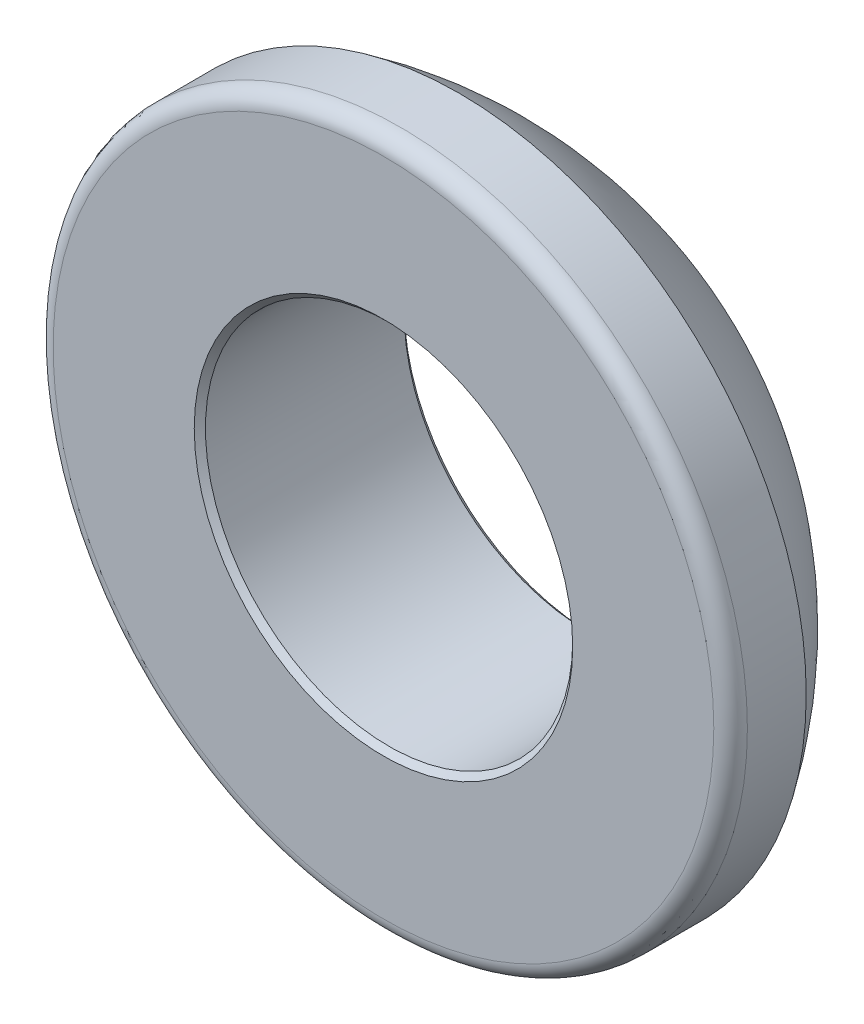
ISO-10303-21;
HEADER;
FILE_DESCRIPTION(('STEP AP214'),'2;1');
FILE_NAME('part.step','',(''),(''),'','','');
FILE_SCHEMA(('AUTOMOTIVE_DESIGN { 1 0 10303 214 1 1 1 1 }'));
ENDSEC;
DATA;
#1=APPLICATION_CONTEXT('core data for automotive mechanical design processes');
#2=APPLICATION_PROTOCOL_DEFINITION('international standard','automotive_design',2000,#1);
#3=PRODUCT_CONTEXT('',#1,'mechanical');
#4=PRODUCT('Part','Part','',(#3));
#5=PRODUCT_RELATED_PRODUCT_CATEGORY('part','',(#4));
#6=PRODUCT_DEFINITION_FORMATION('','',#4);
#7=PRODUCT_DEFINITION_CONTEXT('part definition',#1,'design');
#8=PRODUCT_DEFINITION('design','',#6,#7);
#9=PRODUCT_DEFINITION_SHAPE('','',#8);
#10=(LENGTH_UNIT() NAMED_UNIT(*) SI_UNIT(.MILLI.,.METRE.));
#11=(NAMED_UNIT(*) PLANE_ANGLE_UNIT() SI_UNIT($,.RADIAN.));
#12=(NAMED_UNIT(*) SI_UNIT($,.STERADIAN.) SOLID_ANGLE_UNIT());
#13=UNCERTAINTY_MEASURE_WITH_UNIT(LENGTH_MEASURE(1.E-05),#10,'distance_accuracy_value','');
#14=(GEOMETRIC_REPRESENTATION_CONTEXT(3) GLOBAL_UNCERTAINTY_ASSIGNED_CONTEXT((#13)) GLOBAL_UNIT_ASSIGNED_CONTEXT((#10,
#11,#12)) REPRESENTATION_CONTEXT('',''));
#15=CARTESIAN_POINT('',(0.,0.,0.));
#16=DIRECTION('',(0.,0.,1.));
#17=DIRECTION('',(1.,0.,0.));
#18=AXIS2_PLACEMENT_3D('',#15,#16,#17);
#19=CARTESIAN_POINT('',(0.,0.,-32.6431473881215));
#20=DIRECTION('',(0.,0.,1.));
#21=DIRECTION('',(1.,0.,0.));
#22=AXIS2_PLACEMENT_3D('',#19,#20,#21);
#23=CYLINDRICAL_SURFACE('',#22,8.3312);
#24=CARTESIAN_POINT('',(0.,0.,-9.271));
#25=DIRECTION('',(0.,0.,1.));
#26=DIRECTION('',(1.,0.,0.));
#27=AXIS2_PLACEMENT_3D('',#24,#25,#26);
#28=CIRCLE('',#27,8.3312);
#29=CARTESIAN_POINT('',(8.3312,0.,-9.271));
#30=VERTEX_POINT('',#29);
#31=EDGE_CURVE('E10',#30,#30,#28,.T.);
#32=ORIENTED_EDGE('',*,*,#31,.F.);
#33=EDGE_LOOP('',(#32));
#34=FACE_BOUND('',#33,.T.);
#35=CARTESIAN_POINT('',(0.,0.,-0.254000000000004));
#36=DIRECTION('',(0.,0.,1.));
#37=DIRECTION('',(1.,0.,0.));
#38=AXIS2_PLACEMENT_3D('',#35,#36,#37);
#39=CIRCLE('',#38,8.3312);
#40=CARTESIAN_POINT('',(8.3312,0.,-0.254000000000004));
#41=VERTEX_POINT('',#40);
#42=EDGE_CURVE('E62',#41,#41,#39,.T.);
#43=ORIENTED_EDGE('',*,*,#42,.T.);
#44=EDGE_LOOP('',(#43));
#45=FACE_BOUND('',#44,.T.);
#46=ADVANCED_FACE('F34',(#34,#45),#23,.F.);
#47=CARTESIAN_POINT('',(0.,0.,-9.271));
#48=DIRECTION('',(0.,0.,-1.));
#49=DIRECTION('',(-1.,0.,0.));
#50=AXIS2_PLACEMENT_3D('',#47,#48,#49);
#51=CONICAL_SURFACE('',#50,8.3312,0.785398163397448);
#52=CARTESIAN_POINT('',(0.,0.,-9.525));
#53=DIRECTION('',(0.,0.,1.));
#54=DIRECTION('',(1.,0.,0.));
#55=AXIS2_PLACEMENT_3D('',#52,#53,#54);
#56=CIRCLE('',#55,8.5852);
#57=CARTESIAN_POINT('',(8.5852,0.,-9.525));
#58=VERTEX_POINT('',#57);
#59=EDGE_CURVE('E40',#58,#58,#56,.T.);
#60=ORIENTED_EDGE('',*,*,#59,.F.);
#61=EDGE_LOOP('',(#60));
#62=FACE_BOUND('',#61,.T.);
#63=ORIENTED_EDGE('',*,*,#31,.T.);
#64=EDGE_LOOP('',(#63));
#65=FACE_BOUND('',#64,.T.);
#66=ADVANCED_FACE('F99',(#62,#65),#51,.F.);
#67=CARTESIAN_POINT('',(0.,8.5852,-9.525));
#68=DIRECTION('',(0.,0.,1.));
#69=DIRECTION('',(1.,0.,0.));
#70=AXIS2_PLACEMENT_3D('',#67,#68,#69);
#71=PLANE('',#70);
#72=CARTESIAN_POINT('',(0.,0.,-9.525));
#73=DIRECTION('',(0.,0.,1.));
#74=DIRECTION('',(1.,0.,0.));
#75=AXIS2_PLACEMENT_3D('',#72,#73,#74);
#76=CIRCLE('',#75,9.10922052428201);
#77=CARTESIAN_POINT('',(0.,9.10922052428202,-9.525));
#78=VERTEX_POINT('',#77);
#79=EDGE_CURVE('E44',#78,#78,#76,.T.);
#80=ORIENTED_EDGE('',*,*,#79,.F.);
#81=EDGE_LOOP('',(#80));
#82=FACE_BOUND('',#81,.T.);
#83=ORIENTED_EDGE('',*,*,#59,.T.);
#84=EDGE_LOOP('',(#83));
#85=FACE_BOUND('',#84,.T.);
#86=ADVANCED_FACE('F94',(#82,#85),#71,.F.);
#87=CARTESIAN_POINT('',(0.,0.,7.06119999999998));
#88=DIRECTION('',(0.,0.,1.));
#89=DIRECTION('',(0.,1.,0.));
#90=AXIS2_PLACEMENT_3D('',#87,#88,#89);
#91=SPHERICAL_SURFACE('',#90,18.923);
#92=CARTESIAN_POINT('',(0.,0.,-3.43072189258004));
#93=DIRECTION('',(0.,0.,1.));
#94=DIRECTION('',(1.,0.,0.));
#95=AXIS2_PLACEMENT_3D('',#92,#93,#94);
#96=CIRCLE('',#95,15.748);
#97=CARTESIAN_POINT('',(0.,15.748,-3.43072189258004));
#98=VERTEX_POINT('',#97);
#99=EDGE_CURVE('E48',#98,#98,#96,.T.);
#100=CARTESIAN_POINT('',(0.,15.748,-3.43072189258004));
#101=CARTESIAN_POINT('',(0.,15.6954466871849,-3.50960264210699));
#102=CARTESIAN_POINT('',(0.,15.642300618181,-3.58808847290936));
#103=CARTESIAN_POINT('',(0.,15.5348351771594,-3.74425271869924));
#104=CARTESIAN_POINT('',(0.,15.4805158051416,-3.82193113368676));
#105=CARTESIAN_POINT('',(0.,15.3707159674557,-3.97646296948126));
#106=CARTESIAN_POINT('',(0.,15.3152355017876,-4.05331639028824));
#107=CARTESIAN_POINT('',(0.,15.203126019329,-4.20618089449141));
#108=CARTESIAN_POINT('',(0.,15.1464970025385,-4.28219197788759));
#109=CARTESIAN_POINT('',(0.,15.0321032006851,-4.43335464114959));
#110=CARTESIAN_POINT('',(0.,14.9743384156223,-4.5085062210154));
#111=CARTESIAN_POINT('',(0.,14.8576861216284,-4.65793290868094));
#112=CARTESIAN_POINT('',(0.,14.7987986126973,-4.73220801648066));
#113=CARTESIAN_POINT('',(0.,14.6799141675173,-4.87986498844647));
#114=CARTESIAN_POINT('',(0.,14.6199172312682,-4.95324685261255));
#115=CARTESIAN_POINT('',(0.,14.4988274788778,-5.09910076769036));
#116=CARTESIAN_POINT('',(0.,14.4377346627365,-5.17157281860209));
#117=CARTESIAN_POINT('',(0.,14.3144669453393,-5.31559074291942));
#118=CARTESIAN_POINT('',(0.,14.2522920440835,-5.38713661632503));
#119=CARTESIAN_POINT('',(0.,14.1268741955974,-5.52928603052797));
#120=CARTESIAN_POINT('',(0.,14.063631248367,-5.59988957132529));
#121=CARTESIAN_POINT('',(0.,13.9360915882298,-5.74013837798397));
#122=CARTESIAN_POINT('',(0.,13.871794875323,-5.80978364384532));
#123=CARTESIAN_POINT('',(0.,13.7421622020741,-5.94810017468478));
#124=CARTESIAN_POINT('',(0.,13.6768262417321,-6.01677143966288));
#125=CARTESIAN_POINT('',(0.,13.5451298265161,-6.15312446271829));
#126=CARTESIAN_POINT('',(0.,13.4787693716421,-6.22080622079559));
#127=CARTESIAN_POINT('',(0.,13.3450389515973,-6.35516494746323));
#128=CARTESIAN_POINT('',(0.,13.2776689864265,-6.42184191605357));
#129=CARTESIAN_POINT('',(0.,13.1419347579711,-6.55417600804324));
#130=CARTESIAN_POINT('',(0.,13.0735704946866,-6.61983313144258));
#131=CARTESIAN_POINT('',(0.,12.9358631067001,-6.75011270762793));
#132=CARTESIAN_POINT('',(0.,12.8665199819981,-6.81473516041396));
#133=CARTESIAN_POINT('',(0.,12.7268705289007,-6.94293080357969));
#134=CARTESIAN_POINT('',(0.,12.6565642005051,-7.0065039939594));
#135=CARTESIAN_POINT('',(0.,12.5150042152365,-7.13258675744367));
#136=CARTESIAN_POINT('',(0.,12.4437505583633,-7.19509633054823));
#137=CARTESIAN_POINT('',(0.,12.3003120052626,-7.31903774477885));
#138=CARTESIAN_POINT('',(0.,12.2281271090351,-7.3804695859049));
#139=CARTESIAN_POINT('',(0.,12.0828423766235,-7.50224166482776));
#140=CARTESIAN_POINT('',(0.,12.0097425404394,-7.56258190262456));
#141=CARTESIAN_POINT('',(0.,11.8626444341065,-7.68215715002289));
#142=CARTESIAN_POINT('',(0.,11.7886461639577,-7.74139215962442));
#143=CARTESIAN_POINT('',(0.,11.6397678985542,-7.85874357532759));
#144=CARTESIAN_POINT('',(0.,11.5648879032995,-7.91685998142924));
#145=CARTESIAN_POINT('',(0.,11.4142630956369,-8.03196106740891));
#146=CARTESIAN_POINT('',(0.,11.338518283229,-8.08894574728694));
#147=CARTESIAN_POINT('',(0.,11.1861809444902,-8.20177051364217));
#148=CARTESIAN_POINT('',(0.,11.1095884181592,-8.25761060011938));
#149=CARTESIAN_POINT('',(0.,10.9555729462146,-8.3681335709383));
#150=CARTESIAN_POINT('',(0.,10.8781500006008,-8.42281645528001));
#151=CARTESIAN_POINT('',(0.,10.7224911722558,-8.531012674418));
#152=CARTESIAN_POINT('',(0.,10.6442552895246,-8.58452600921428));
#153=CARTESIAN_POINT('',(0.,10.4869882526127,-8.69037104583308));
#154=CARTESIAN_POINT('',(0.,10.407957098432,-8.74270274765559));
#155=CARTESIAN_POINT('',(0.,10.249117364082,-8.84617270209814));
#156=CARTESIAN_POINT('',(0.,10.1693087839126,-8.89731095471818));
#157=CARTESIAN_POINT('',(0.,10.0089322177692,-8.99838246256776));
#158=CARTESIAN_POINT('',(0.,9.92836423179523,-9.04831571779732));
#159=CARTESIAN_POINT('',(0.,9.76648704876063,-9.1469659601447));
#160=CARTESIAN_POINT('',(0.,9.68517785170002,-9.19568294726253));
#161=CARTESIAN_POINT('',(0.,9.52183659715804,-9.29188963723008));
#162=CARTESIAN_POINT('',(0.,9.43980453967668,-9.3393793400798));
#163=CARTESIAN_POINT('',(0.,9.27503612079406,-9.43312079737606));
#164=CARTESIAN_POINT('',(0.,9.1922997593928,-9.47937255182259));
#165=CARTESIAN_POINT('',(0.,9.10922052428202,-9.525));
#166=B_SPLINE_CURVE_WITH_KNOTS('',3,(#100,#101,#102,#103,#104,#105,#106,#107,#108,#109,#110,
#111,#112,#113,#114,#115,#116,#117,#118,#119,#120,#121,#122,#123,#124,#125,#126,#127,#128,#129,
#130,#131,#132,#133,#134,#135,#136,#137,#138,#139,#140,#141,#142,#143,#144,#145,#146,#147,#148,
#149,#150,#151,#152,#153,#154,#155,#156,#157,#158,#159,#160,#161,#162,#163,#164,#165),
.UNSPECIFIED.,.F.,.F.,(4,2,2,2,2,2,2,2,2,2,2,2,2,2,2,2,2,2,2,2,2,2,2,2,2,2,2,2,2,2,2,2,4),(0.,
0.284349586078975,0.568699172157954,0.853048758236928,1.1373983443159,1.42174793039488,
1.70609751647386,1.99044710255283,2.27479668863181,2.55914627471078,2.84349586078976,
3.12784544686873,3.41219503294771,3.69654461902669,3.98089420510566,4.26524379118464,
4.54959337726361,4.83394296334259,5.11829254942156,5.40264213550054,5.68699172157952,
5.97134130765849,6.25569089373747,6.54004047981644,6.82439006589542,7.10873965197439,
7.39308923805337,7.67743882413234,7.96178841021132,8.2461379962903,8.53048758236927,
8.81483716844825,9.09918675452722),.UNSPECIFIED.);
#167=EDGE_CURVE('BSEAM88',#98,#78,#166,.T.);
#168=ORIENTED_EDGE('',*,*,#99,.F.);
#169=ORIENTED_EDGE('',*,*,#79,.T.);
#170=ORIENTED_EDGE('',*,*,#167,.T.);
#171=ORIENTED_EDGE('',*,*,#167,.F.);
#172=EDGE_LOOP('',(#168,#170,#169,#171));
#173=FACE_BOUND('',#172,.T.);
#174=ADVANCED_FACE('F88',(#173),#91,.T.);
#175=CARTESIAN_POINT('',(0.,0.,-32.6431473881215));
#176=DIRECTION('',(0.,0.,1.));
#177=DIRECTION('',(1.,0.,0.));
#178=AXIS2_PLACEMENT_3D('',#175,#176,#177);
#179=CYLINDRICAL_SURFACE('',#178,15.748);
#180=CARTESIAN_POINT('',(0.,0.,-0.761999999999999));
#181=DIRECTION('',(0.,0.,1.));
#182=DIRECTION('',(1.,0.,0.));
#183=AXIS2_PLACEMENT_3D('',#180,#181,#182);
#184=CIRCLE('',#183,15.748);
#185=CARTESIAN_POINT('',(15.748,0.,-0.761999999999999));
#186=VERTEX_POINT('',#185);
#187=EDGE_CURVE('E53',#186,#186,#184,.T.);
#188=ORIENTED_EDGE('',*,*,#187,.F.);
#189=EDGE_LOOP('',(#188));
#190=FACE_BOUND('',#189,.T.);
#191=ORIENTED_EDGE('',*,*,#99,.T.);
#192=EDGE_LOOP('',(#191));
#193=FACE_BOUND('',#192,.T.);
#194=ADVANCED_FACE('F82',(#190,#193),#179,.T.);
#195=CARTESIAN_POINT('',(0.,0.,-0.762));
#196=DIRECTION('',(0.,0.,1.));
#197=DIRECTION('',(1.,0.,0.));
#198=AXIS2_PLACEMENT_3D('',#195,#196,#197);
#199=TOROIDAL_SURFACE('',#198,14.986,0.762);
#200=CARTESIAN_POINT('',(0.,0.,0.));
#201=DIRECTION('',(0.,0.,1.));
#202=DIRECTION('',(1.,0.,0.));
#203=AXIS2_PLACEMENT_3D('',#200,#201,#202);
#204=CIRCLE('',#203,14.986);
#205=CARTESIAN_POINT('',(14.986,0.,0.));
#206=VERTEX_POINT('',#205);
#207=EDGE_CURVE('E56',#206,#206,#204,.T.);
#208=ORIENTED_EDGE('',*,*,#207,.F.);
#209=EDGE_LOOP('',(#208));
#210=FACE_BOUND('',#209,.T.);
#211=ORIENTED_EDGE('',*,*,#187,.T.);
#212=EDGE_LOOP('',(#211));
#213=FACE_BOUND('',#212,.T.);
#214=ADVANCED_FACE('F76',(#210,#213),#199,.T.);
#215=CARTESIAN_POINT('',(0.,8.5852,0.));
#216=DIRECTION('',(0.,0.,-1.));
#217=DIRECTION('',(-1.,0.,0.));
#218=AXIS2_PLACEMENT_3D('',#215,#216,#217);
#219=PLANE('',#218);
#220=CARTESIAN_POINT('',(0.,0.,0.));
#221=DIRECTION('',(0.,0.,1.));
#222=DIRECTION('',(1.,0.,0.));
#223=AXIS2_PLACEMENT_3D('',#220,#221,#222);
#224=CIRCLE('',#223,8.5852);
#225=CARTESIAN_POINT('',(8.5852,0.,0.));
#226=VERTEX_POINT('',#225);
#227=EDGE_CURVE('E59',#226,#226,#224,.T.);
#228=ORIENTED_EDGE('',*,*,#227,.F.);
#229=EDGE_LOOP('',(#228));
#230=FACE_BOUND('',#229,.T.);
#231=ORIENTED_EDGE('',*,*,#207,.T.);
#232=EDGE_LOOP('',(#231));
#233=FACE_BOUND('',#232,.T.);
#234=ADVANCED_FACE('F70',(#230,#233),#219,.F.);
#235=CARTESIAN_POINT('',(0.,0.,0.));
#236=DIRECTION('',(0.,0.,1.));
#237=DIRECTION('',(1.,0.,0.));
#238=AXIS2_PLACEMENT_3D('',#235,#236,#237);
#239=CONICAL_SURFACE('',#238,8.5852,0.785398163397442);
#240=ORIENTED_EDGE('',*,*,#42,.F.);
#241=EDGE_LOOP('',(#240));
#242=FACE_BOUND('',#241,.T.);
#243=ORIENTED_EDGE('',*,*,#227,.T.);
#244=EDGE_LOOP('',(#243));
#245=FACE_BOUND('',#244,.T.);
#246=ADVANCED_FACE('F67',(#242,#245),#239,.F.);
#247=CLOSED_SHELL('',(#46,#66,#86,#174,#194,#214,#234,#246));
#248=MANIFOLD_SOLID_BREP('B2',#247);
#249=ADVANCED_BREP_SHAPE_REPRESENTATION('',(#18,#248),#14);
#250=SHAPE_DEFINITION_REPRESENTATION(#9,#249);
ENDSEC;
END-ISO-10303-21;
